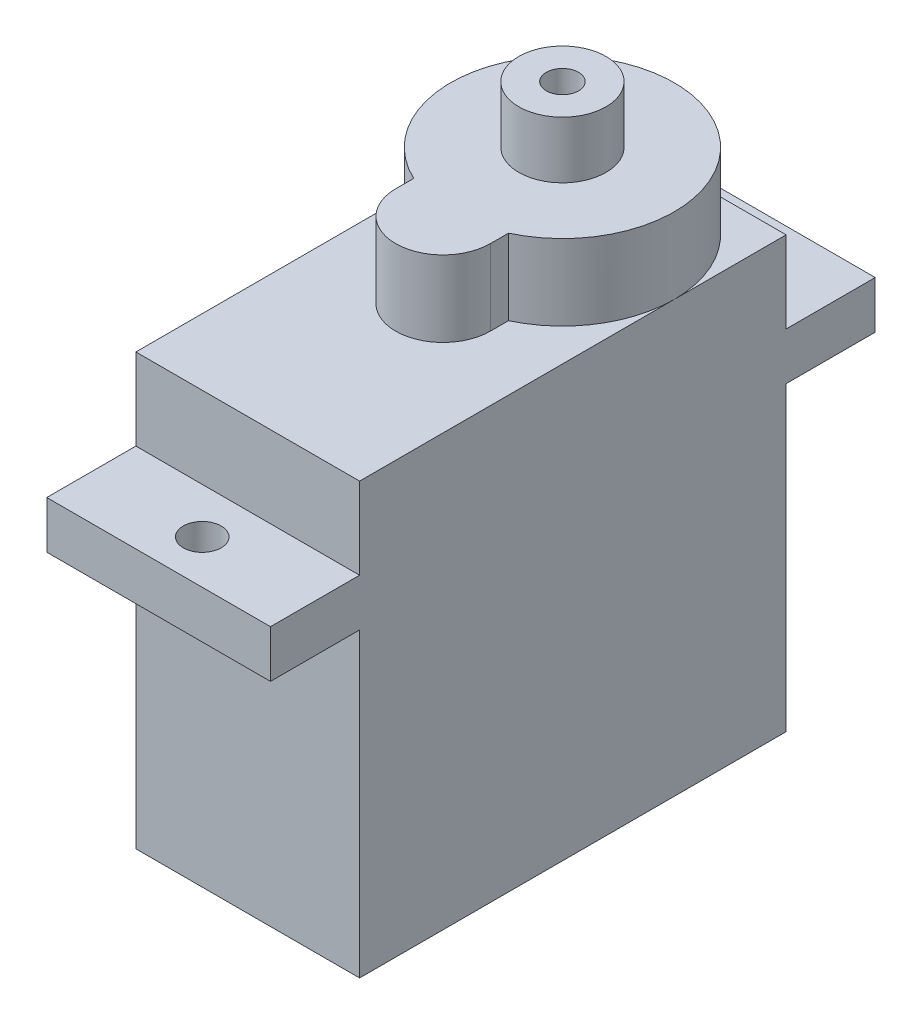
ISO-10303-21;
HEADER;
FILE_DESCRIPTION(('STEP AP214'),'2;1');
FILE_NAME('part.step','',(''),(''),'','','');
FILE_SCHEMA(('AUTOMOTIVE_DESIGN { 1 0 10303 214 1 1 1 1 }'));
ENDSEC;
DATA;
#1=APPLICATION_CONTEXT('core data for automotive mechanical design processes');
#2=APPLICATION_PROTOCOL_DEFINITION('international standard','automotive_design',2000,#1);
#3=PRODUCT_CONTEXT('',#1,'mechanical');
#4=PRODUCT('Part','Part','',(#3));
#5=PRODUCT_RELATED_PRODUCT_CATEGORY('part','',(#4));
#6=PRODUCT_DEFINITION_FORMATION('','',#4);
#7=PRODUCT_DEFINITION_CONTEXT('part definition',#1,'design');
#8=PRODUCT_DEFINITION('design','',#6,#7);
#9=PRODUCT_DEFINITION_SHAPE('','',#8);
#10=(LENGTH_UNIT() NAMED_UNIT(*) SI_UNIT(.MILLI.,.METRE.));
#11=(NAMED_UNIT(*) PLANE_ANGLE_UNIT() SI_UNIT($,.RADIAN.));
#12=(NAMED_UNIT(*) SI_UNIT($,.STERADIAN.) SOLID_ANGLE_UNIT());
#13=UNCERTAINTY_MEASURE_WITH_UNIT(LENGTH_MEASURE(1.E-05),#10,'distance_accuracy_value','');
#14=(GEOMETRIC_REPRESENTATION_CONTEXT(3) GLOBAL_UNCERTAINTY_ASSIGNED_CONTEXT((#13)) GLOBAL_UNIT_ASSIGNED_CONTEXT((#10,
#11,#12)) REPRESENTATION_CONTEXT('',''));
#15=CARTESIAN_POINT('',(0.,0.,0.));
#16=DIRECTION('',(0.,0.,1.));
#17=DIRECTION('',(1.,0.,0.));
#18=AXIS2_PLACEMENT_3D('',#15,#16,#17);
#19=CARTESIAN_POINT('',(0.,0.,22.5));
#20=DIRECTION('',(0.,0.,1.));
#21=DIRECTION('',(1.,0.,0.));
#22=AXIS2_PLACEMENT_3D('',#19,#20,#21);
#23=PLANE('',#22);
#24=DIRECTION('',(0.,1.,0.));
#25=VECTOR('',#24,1.);
#26=CARTESIAN_POINT('',(5.9,11.35,22.5));
#27=LINE('',#26,#25);
#28=CARTESIAN_POINT('',(5.9,-11.35,22.5));
#29=VERTEX_POINT('',#28);
#30=CARTESIAN_POINT('',(5.9,4.55,22.5));
#31=VERTEX_POINT('',#30);
#32=EDGE_CURVE('E75',#29,#31,#27,.T.);
#33=ORIENTED_EDGE('',*,*,#32,.T.);
#34=DIRECTION('',(-1.,0.,0.));
#35=VECTOR('',#34,1.);
#36=CARTESIAN_POINT('',(11.2235326616825,4.55,22.5));
#37=LINE('',#36,#35);
#38=CARTESIAN_POINT('',(-5.9,4.55,22.5));
#39=VERTEX_POINT('',#38);
#40=EDGE_CURVE('E208',#31,#39,#37,.T.);
#41=ORIENTED_EDGE('',*,*,#40,.T.);
#42=DIRECTION('',(0.,-1.,0.));
#43=VECTOR('',#42,1.);
#44=CARTESIAN_POINT('',(-5.9,11.35,22.5));
#45=LINE('',#44,#43);
#46=CARTESIAN_POINT('',(-5.9,-11.35,22.5));
#47=VERTEX_POINT('',#46);
#48=EDGE_CURVE('E200',#39,#47,#45,.T.);
#49=ORIENTED_EDGE('',*,*,#48,.T.);
#50=DIRECTION('',(1.,0.,0.));
#51=VECTOR('',#50,1.);
#52=CARTESIAN_POINT('',(-5.9,-11.35,22.5));
#53=LINE('',#52,#51);
#54=EDGE_CURVE('E336',#47,#29,#53,.T.);
#55=ORIENTED_EDGE('',*,*,#54,.T.);
#56=EDGE_LOOP('',(#33,#41,#49,#55));
#57=FACE_BOUND('',#56,.T.);
#58=ADVANCED_FACE('F49',(#57),#23,.T.);
#59=CARTESIAN_POINT('',(0.,0.,0.));
#60=DIRECTION('',(0.,0.,1.));
#61=DIRECTION('',(1.,0.,0.));
#62=AXIS2_PLACEMENT_3D('',#59,#60,#61);
#63=PLANE('',#62);
#64=DIRECTION('',(0.,1.,0.));
#65=VECTOR('',#64,1.);
#66=CARTESIAN_POINT('',(5.9,11.35,0.));
#67=LINE('',#66,#65);
#68=CARTESIAN_POINT('',(5.9,7.05,0.));
#69=VERTEX_POINT('',#68);
#70=CARTESIAN_POINT('',(5.9,11.35,0.));
#71=VERTEX_POINT('',#70);
#72=EDGE_CURVE('E370',#69,#71,#67,.T.);
#73=ORIENTED_EDGE('',*,*,#72,.F.);
#74=DIRECTION('',(-1.,0.,0.));
#75=VECTOR('',#74,1.);
#76=CARTESIAN_POINT('',(11.2235326616825,7.05,0.));
#77=LINE('',#76,#75);
#78=CARTESIAN_POINT('',(-5.9,7.05,0.));
#79=VERTEX_POINT('',#78);
#80=EDGE_CURVE('E264',#69,#79,#77,.T.);
#81=ORIENTED_EDGE('',*,*,#80,.T.);
#82=DIRECTION('',(0.,-1.,0.));
#83=VECTOR('',#82,1.);
#84=CARTESIAN_POINT('',(-5.9,11.35,0.));
#85=LINE('',#84,#83);
#86=CARTESIAN_POINT('',(-5.9,11.35,0.));
#87=VERTEX_POINT('',#86);
#88=EDGE_CURVE('E374',#87,#79,#85,.T.);
#89=ORIENTED_EDGE('',*,*,#88,.F.);
#90=DIRECTION('',(-1.,0.,0.));
#91=VECTOR('',#90,1.);
#92=CARTESIAN_POINT('',(-5.9,11.35,0.));
#93=LINE('',#92,#91);
#94=CARTESIAN_POINT('',(0.,11.35,0.));
#95=VERTEX_POINT('',#94);
#96=EDGE_CURVE('E365',#95,#87,#93,.T.);
#97=ORIENTED_EDGE('',*,*,#96,.F.);
#98=EDGE_CURVE('E361',#71,#95,#93,.T.);
#99=ORIENTED_EDGE('',*,*,#98,.F.);
#100=EDGE_LOOP('',(#73,#81,#89,#97,#99));
#101=FACE_BOUND('',#100,.T.);
#102=ADVANCED_FACE('F404',(#101),#63,.F.);
#103=CARTESIAN_POINT('',(-5.9,11.35,22.5));
#104=DIRECTION('',(0.,-1.,0.));
#105=DIRECTION('',(0.,0.,-1.));
#106=AXIS2_PLACEMENT_3D('',#103,#104,#105);
#107=PLANE('',#106);
#108=CARTESIAN_POINT('',(0.,11.35,5.9));
#109=DIRECTION('',(0.,1.,0.));
#110=DIRECTION('',(0.,0.,1.));
#111=AXIS2_PLACEMENT_3D('',#108,#109,#110);
#112=CIRCLE('',#111,5.9);
#113=CARTESIAN_POINT('',(-5.9,11.35,5.9));
#114=VERTEX_POINT('',#113);
#115=EDGE_CURVE('E59',#95,#114,#112,.T.);
#116=ORIENTED_EDGE('',*,*,#115,.F.);
#117=ORIENTED_EDGE('',*,*,#96,.T.);
#118=DIRECTION('',(0.,0.,-1.));
#119=VECTOR('',#118,1.);
#120=CARTESIAN_POINT('',(-5.9,11.35,22.5));
#121=LINE('',#120,#119);
#122=EDGE_CURVE('E360',#114,#87,#121,.T.);
#123=ORIENTED_EDGE('',*,*,#122,.F.);
#124=EDGE_LOOP('',(#116,#117,#123));
#125=FACE_BOUND('',#124,.T.);
#126=ADVANCED_FACE('F409',(#125),#107,.F.);
#127=CARTESIAN_POINT('',(-2.5,11.35,11.244155686355));
#128=VERTEX_POINT('',#127);
#129=EDGE_CURVE('E437',#114,#128,#112,.T.);
#130=ORIENTED_EDGE('',*,*,#129,.F.);
#131=CARTESIAN_POINT('',(-5.9,11.35,22.5));
#132=VERTEX_POINT('',#131);
#133=EDGE_CURVE('E356',#132,#114,#121,.T.);
#134=ORIENTED_EDGE('',*,*,#133,.F.);
#135=DIRECTION('',(-1.,0.,0.));
#136=VECTOR('',#135,1.);
#137=CARTESIAN_POINT('',(-5.9,11.35,22.5));
#138=LINE('',#137,#136);
#139=CARTESIAN_POINT('',(5.9,11.35,22.5));
#140=VERTEX_POINT('',#139);
#141=EDGE_CURVE('E377',#140,#132,#138,.T.);
#142=ORIENTED_EDGE('',*,*,#141,.F.);
#143=DIRECTION('',(0.,0.,-1.));
#144=VECTOR('',#143,1.);
#145=CARTESIAN_POINT('',(5.9,11.35,22.5));
#146=LINE('',#145,#144);
#147=CARTESIAN_POINT('',(5.9,11.35,5.9));
#148=VERTEX_POINT('',#147);
#149=EDGE_CURVE('E351',#140,#148,#146,.T.);
#150=ORIENTED_EDGE('',*,*,#149,.T.);
#151=CARTESIAN_POINT('',(2.5,11.35,11.244155686355));
#152=VERTEX_POINT('',#151);
#153=EDGE_CURVE('E310',#152,#148,#112,.T.);
#154=ORIENTED_EDGE('',*,*,#153,.F.);
#155=DIRECTION('',(0.,0.,-1.));
#156=VECTOR('',#155,1.);
#157=CARTESIAN_POINT('',(2.5,11.35,12.2));
#158=LINE('',#157,#156);
#159=CARTESIAN_POINT('',(2.5,11.35,12.2));
#160=VERTEX_POINT('',#159);
#161=EDGE_CURVE('E306',#160,#152,#158,.T.);
#162=ORIENTED_EDGE('',*,*,#161,.F.);
#163=CARTESIAN_POINT('',(0.,11.35,12.2));
#164=DIRECTION('',(0.,1.,0.));
#165=DIRECTION('',(0.,0.,1.));
#166=AXIS2_PLACEMENT_3D('',#163,#164,#165);
#167=CIRCLE('',#166,2.5);
#168=CARTESIAN_POINT('',(-2.5,11.35,12.2));
#169=VERTEX_POINT('',#168);
#170=EDGE_CURVE('E284',#169,#160,#167,.T.);
#171=ORIENTED_EDGE('',*,*,#170,.F.);
#172=DIRECTION('',(0.,0.,1.));
#173=VECTOR('',#172,1.);
#174=CARTESIAN_POINT('',(-2.5,11.35,12.2));
#175=LINE('',#174,#173);
#176=EDGE_CURVE('E293',#128,#169,#175,.T.);
#177=ORIENTED_EDGE('',*,*,#176,.F.);
#178=EDGE_LOOP('',(#130,#134,#142,#150,#154,#162,#171,#177));
#179=FACE_BOUND('',#178,.T.);
#180=ADVANCED_FACE('F418',(#179),#107,.F.);
#181=EDGE_CURVE('E314',#148,#95,#112,.T.);
#182=ORIENTED_EDGE('',*,*,#181,.F.);
#183=EDGE_CURVE('E355',#148,#71,#146,.T.);
#184=ORIENTED_EDGE('',*,*,#183,.T.);
#185=ORIENTED_EDGE('',*,*,#98,.T.);
#186=EDGE_LOOP('',(#182,#184,#185));
#187=FACE_BOUND('',#186,.T.);
#188=ADVANCED_FACE('F420',(#187),#107,.F.);
#189=CARTESIAN_POINT('',(-5.9,11.35,22.5));
#190=DIRECTION('',(1.,0.,0.));
#191=DIRECTION('',(0.,1.,0.));
#192=AXIS2_PLACEMENT_3D('',#189,#190,#191);
#193=PLANE('',#192);
#194=ORIENTED_EDGE('',*,*,#88,.T.);
#195=DIRECTION('',(0.,0.,-1.));
#196=VECTOR('',#195,1.);
#197=CARTESIAN_POINT('',(-5.9,7.05,-4.7));
#198=LINE('',#197,#196);
#199=CARTESIAN_POINT('',(-5.9,7.05,-4.7));
#200=VERTEX_POINT('',#199);
#201=EDGE_CURVE('E257',#79,#200,#198,.T.);
#202=ORIENTED_EDGE('',*,*,#201,.T.);
#203=DIRECTION('',(0.,-1.,0.));
#204=VECTOR('',#203,1.);
#205=CARTESIAN_POINT('',(-5.9,7.05,-4.7));
#206=LINE('',#205,#204);
#207=CARTESIAN_POINT('',(-5.9,4.55,-4.7));
#208=VERTEX_POINT('',#207);
#209=EDGE_CURVE('E238',#200,#208,#206,.T.);
#210=ORIENTED_EDGE('',*,*,#209,.T.);
#211=DIRECTION('',(0.,0.,1.));
#212=VECTOR('',#211,1.);
#213=CARTESIAN_POINT('',(-5.9,4.55,0.));
#214=LINE('',#213,#212);
#215=CARTESIAN_POINT('',(-5.9,4.55,0.));
#216=VERTEX_POINT('',#215);
#217=EDGE_CURVE('E242',#208,#216,#214,.T.);
#218=ORIENTED_EDGE('',*,*,#217,.T.);
#219=CARTESIAN_POINT('',(-5.9,-11.35,0.));
#220=VERTEX_POINT('',#219);
#221=EDGE_CURVE('E333',#216,#220,#85,.T.);
#222=ORIENTED_EDGE('',*,*,#221,.T.);
#223=DIRECTION('',(0.,0.,-1.));
#224=VECTOR('',#223,1.);
#225=CARTESIAN_POINT('',(-5.9,-11.35,22.5));
#226=LINE('',#225,#224);
#227=EDGE_CURVE('E343',#47,#220,#226,.T.);
#228=ORIENTED_EDGE('',*,*,#227,.F.);
#229=ORIENTED_EDGE('',*,*,#48,.F.);
#230=DIRECTION('',(0.,0.,1.));
#231=VECTOR('',#230,1.);
#232=CARTESIAN_POINT('',(-5.9,4.55,22.5));
#233=LINE('',#232,#231);
#234=CARTESIAN_POINT('',(-5.9,4.55,27.2));
#235=VERTEX_POINT('',#234);
#236=EDGE_CURVE('E180',#39,#235,#233,.T.);
#237=ORIENTED_EDGE('',*,*,#236,.T.);
#238=DIRECTION('',(0.,1.,0.));
#239=VECTOR('',#238,1.);
#240=CARTESIAN_POINT('',(-5.9,7.05,27.2));
#241=LINE('',#240,#239);
#242=CARTESIAN_POINT('',(-5.9,7.05,27.2));
#243=VERTEX_POINT('',#242);
#244=EDGE_CURVE('E189',#235,#243,#241,.T.);
#245=ORIENTED_EDGE('',*,*,#244,.T.);
#246=DIRECTION('',(0.,0.,-1.));
#247=VECTOR('',#246,1.);
#248=CARTESIAN_POINT('',(-5.9,7.05,27.2));
#249=LINE('',#248,#247);
#250=CARTESIAN_POINT('',(-5.9,7.05,22.5));
#251=VERTEX_POINT('',#250);
#252=EDGE_CURVE('E186',#243,#251,#249,.T.);
#253=ORIENTED_EDGE('',*,*,#252,.T.);
#254=EDGE_CURVE('E340',#132,#251,#45,.T.);
#255=ORIENTED_EDGE('',*,*,#254,.F.);
#256=ORIENTED_EDGE('',*,*,#133,.T.);
#257=ORIENTED_EDGE('',*,*,#122,.T.);
#258=EDGE_LOOP('',(#194,#202,#210,#218,#222,#228,#229,#237,#245,#253,#255,#256,#257));
#259=FACE_BOUND('',#258,.T.);
#260=ADVANCED_FACE('F51',(#259),#193,.F.);
#261=CARTESIAN_POINT('',(-5.9,-11.35,22.5));
#262=DIRECTION('',(0.,1.,0.));
#263=DIRECTION('',(0.,0.,1.));
#264=AXIS2_PLACEMENT_3D('',#261,#262,#263);
#265=PLANE('',#264);
#266=DIRECTION('',(1.,0.,0.));
#267=VECTOR('',#266,1.);
#268=CARTESIAN_POINT('',(-5.9,-11.35,0.));
#269=LINE('',#268,#267);
#270=CARTESIAN_POINT('',(5.9,-11.35,0.));
#271=VERTEX_POINT('',#270);
#272=EDGE_CURVE('E371',#220,#271,#269,.T.);
#273=ORIENTED_EDGE('',*,*,#272,.T.);
#274=DIRECTION('',(0.,0.,-1.));
#275=VECTOR('',#274,1.);
#276=CARTESIAN_POINT('',(5.9,-11.35,22.5));
#277=LINE('',#276,#275);
#278=EDGE_CURVE('E347',#29,#271,#277,.T.);
#279=ORIENTED_EDGE('',*,*,#278,.F.);
#280=ORIENTED_EDGE('',*,*,#54,.F.);
#281=ORIENTED_EDGE('',*,*,#227,.T.);
#282=EDGE_LOOP('',(#273,#279,#280,#281));
#283=FACE_BOUND('',#282,.T.);
#284=ADVANCED_FACE('F388',(#283),#265,.F.);
#285=CARTESIAN_POINT('',(5.9,11.35,22.5));
#286=DIRECTION('',(-1.,0.,0.));
#287=DIRECTION('',(0.,-1.,0.));
#288=AXIS2_PLACEMENT_3D('',#285,#286,#287);
#289=PLANE('',#288);
#290=CARTESIAN_POINT('',(5.9,4.55,0.));
#291=VERTEX_POINT('',#290);
#292=EDGE_CURVE('E366',#271,#291,#67,.T.);
#293=ORIENTED_EDGE('',*,*,#292,.T.);
#294=DIRECTION('',(0.,0.,-1.));
#295=VECTOR('',#294,1.);
#296=CARTESIAN_POINT('',(5.9,4.55,0.));
#297=LINE('',#296,#295);
#298=CARTESIAN_POINT('',(5.9,4.55,-4.7));
#299=VERTEX_POINT('',#298);
#300=EDGE_CURVE('E252',#291,#299,#297,.T.);
#301=ORIENTED_EDGE('',*,*,#300,.T.);
#302=DIRECTION('',(0.,1.,0.));
#303=VECTOR('',#302,1.);
#304=CARTESIAN_POINT('',(5.9,7.05,-4.7));
#305=LINE('',#304,#303);
#306=CARTESIAN_POINT('',(5.9,7.05,-4.7));
#307=VERTEX_POINT('',#306);
#308=EDGE_CURVE('E249',#299,#307,#305,.T.);
#309=ORIENTED_EDGE('',*,*,#308,.T.);
#310=DIRECTION('',(0.,0.,1.));
#311=VECTOR('',#310,1.);
#312=CARTESIAN_POINT('',(5.9,7.05,-4.7));
#313=LINE('',#312,#311);
#314=EDGE_CURVE('E245',#307,#69,#313,.T.);
#315=ORIENTED_EDGE('',*,*,#314,.T.);
#316=ORIENTED_EDGE('',*,*,#72,.T.);
#317=ORIENTED_EDGE('',*,*,#183,.F.);
#318=ORIENTED_EDGE('',*,*,#149,.F.);
#319=CARTESIAN_POINT('',(5.9,7.05,22.5));
#320=VERTEX_POINT('',#319);
#321=EDGE_CURVE('E224',#320,#140,#27,.T.);
#322=ORIENTED_EDGE('',*,*,#321,.F.);
#323=DIRECTION('',(0.,0.,1.));
#324=VECTOR('',#323,1.);
#325=CARTESIAN_POINT('',(5.9,7.05,27.2));
#326=LINE('',#325,#324);
#327=CARTESIAN_POINT('',(5.9,7.05,27.2));
#328=VERTEX_POINT('',#327);
#329=EDGE_CURVE('E212',#320,#328,#326,.T.);
#330=ORIENTED_EDGE('',*,*,#329,.T.);
#331=DIRECTION('',(0.,-1.,0.));
#332=VECTOR('',#331,1.);
#333=CARTESIAN_POINT('',(5.9,7.05,27.2));
#334=LINE('',#333,#332);
#335=CARTESIAN_POINT('',(5.9,4.55,27.2));
#336=VERTEX_POINT('',#335);
#337=EDGE_CURVE('E235',#328,#336,#334,.T.);
#338=ORIENTED_EDGE('',*,*,#337,.T.);
#339=DIRECTION('',(0.,0.,-1.));
#340=VECTOR('',#339,1.);
#341=CARTESIAN_POINT('',(5.9,4.55,22.5));
#342=LINE('',#341,#340);
#343=EDGE_CURVE('E181',#336,#31,#342,.T.);
#344=ORIENTED_EDGE('',*,*,#343,.T.);
#345=ORIENTED_EDGE('',*,*,#32,.F.);
#346=ORIENTED_EDGE('',*,*,#278,.T.);
#347=EDGE_LOOP('',(#293,#301,#309,#315,#316,#317,#318,#322,#330,#338,#344,#345,#346));
#348=FACE_BOUND('',#347,.T.);
#349=ADVANCED_FACE('F391',(#348),#289,.F.);
#350=DIRECTION('',(-1.,0.,0.));
#351=VECTOR('',#350,1.);
#352=CARTESIAN_POINT('',(11.2235326616825,7.05,22.5));
#353=LINE('',#352,#351);
#354=EDGE_CURVE('E67',#320,#251,#353,.T.);
#355=ORIENTED_EDGE('',*,*,#354,.F.);
#356=ORIENTED_EDGE('',*,*,#321,.T.);
#357=ORIENTED_EDGE('',*,*,#141,.T.);
#358=ORIENTED_EDGE('',*,*,#254,.T.);
#359=EDGE_LOOP('',(#355,#356,#357,#358));
#360=FACE_BOUND('',#359,.T.);
#361=ADVANCED_FACE('F393',(#360),#23,.T.);
#362=ORIENTED_EDGE('',*,*,#221,.F.);
#363=DIRECTION('',(-1.,0.,0.));
#364=VECTOR('',#363,1.);
#365=CARTESIAN_POINT('',(11.2235326616825,4.55,0.));
#366=LINE('',#365,#364);
#367=EDGE_CURVE('E268',#291,#216,#366,.T.);
#368=ORIENTED_EDGE('',*,*,#367,.F.);
#369=ORIENTED_EDGE('',*,*,#292,.F.);
#370=ORIENTED_EDGE('',*,*,#272,.F.);
#371=EDGE_LOOP('',(#362,#368,#369,#370));
#372=FACE_BOUND('',#371,.T.);
#373=ADVANCED_FACE('F399',(#372),#63,.F.);
#374=CARTESIAN_POINT('',(0.,15.35,12.2));
#375=DIRECTION('',(0.,-1.,0.));
#376=DIRECTION('',(0.,0.,-1.));
#377=AXIS2_PLACEMENT_3D('',#374,#375,#376);
#378=CYLINDRICAL_SURFACE('',#377,2.5);
#379=ORIENTED_EDGE('',*,*,#170,.T.);
#380=DIRECTION('',(0.,-1.,0.));
#381=VECTOR('',#380,1.);
#382=CARTESIAN_POINT('',(2.5,15.35,12.2));
#383=LINE('',#382,#381);
#384=CARTESIAN_POINT('',(2.5,15.35,12.2));
#385=VERTEX_POINT('',#384);
#386=EDGE_CURVE('E329',#385,#160,#383,.T.);
#387=ORIENTED_EDGE('',*,*,#386,.F.);
#388=CARTESIAN_POINT('',(0.,15.35,12.2));
#389=DIRECTION('',(0.,1.,0.));
#390=DIRECTION('',(0.,0.,1.));
#391=AXIS2_PLACEMENT_3D('',#388,#389,#390);
#392=CIRCLE('',#391,2.5);
#393=CARTESIAN_POINT('',(-2.5,15.35,12.2));
#394=VERTEX_POINT('',#393);
#395=EDGE_CURVE('E288',#394,#385,#392,.T.);
#396=ORIENTED_EDGE('',*,*,#395,.F.);
#397=DIRECTION('',(0.,-1.,0.));
#398=VECTOR('',#397,1.);
#399=CARTESIAN_POINT('',(-2.5,15.35,12.2));
#400=LINE('',#399,#398);
#401=EDGE_CURVE('E302',#394,#169,#400,.T.);
#402=ORIENTED_EDGE('',*,*,#401,.T.);
#403=EDGE_LOOP('',(#379,#387,#396,#402));
#404=FACE_BOUND('',#403,.T.);
#405=ADVANCED_FACE('F413',(#404),#378,.T.);
#406=CARTESIAN_POINT('',(2.5,15.35,12.2));
#407=DIRECTION('',(-1.,0.,0.));
#408=DIRECTION('',(0.,0.,1.));
#409=AXIS2_PLACEMENT_3D('',#406,#407,#408);
#410=PLANE('',#409);
#411=ORIENTED_EDGE('',*,*,#161,.T.);
#412=DIRECTION('',(0.,-1.,0.));
#413=VECTOR('',#412,1.);
#414=CARTESIAN_POINT('',(2.5,15.35,11.244155686355));
#415=LINE('',#414,#413);
#416=CARTESIAN_POINT('',(2.5,15.35,11.244155686355));
#417=VERTEX_POINT('',#416);
#418=EDGE_CURVE('E325',#417,#152,#415,.T.);
#419=ORIENTED_EDGE('',*,*,#418,.F.);
#420=DIRECTION('',(0.,0.,-1.));
#421=VECTOR('',#420,1.);
#422=CARTESIAN_POINT('',(2.5,15.35,12.2));
#423=LINE('',#422,#421);
#424=EDGE_CURVE('E292',#385,#417,#423,.T.);
#425=ORIENTED_EDGE('',*,*,#424,.F.);
#426=ORIENTED_EDGE('',*,*,#386,.T.);
#427=EDGE_LOOP('',(#411,#419,#425,#426));
#428=FACE_BOUND('',#427,.T.);
#429=ADVANCED_FACE('F447',(#428),#410,.F.);
#430=CARTESIAN_POINT('',(0.,15.35,5.9));
#431=DIRECTION('',(0.,-1.,0.));
#432=DIRECTION('',(0.,0.,-1.));
#433=AXIS2_PLACEMENT_3D('',#430,#431,#432);
#434=CYLINDRICAL_SURFACE('',#433,5.9);
#435=ORIENTED_EDGE('',*,*,#153,.T.);
#436=ORIENTED_EDGE('',*,*,#181,.T.);
#437=ORIENTED_EDGE('',*,*,#115,.T.);
#438=ORIENTED_EDGE('',*,*,#129,.T.);
#439=DIRECTION('',(0.,-1.,0.));
#440=VECTOR('',#439,1.);
#441=CARTESIAN_POINT('',(-2.5,15.35,11.244155686355));
#442=LINE('',#441,#440);
#443=CARTESIAN_POINT('',(-2.5,15.35,11.244155686355));
#444=VERTEX_POINT('',#443);
#445=EDGE_CURVE('E321',#444,#128,#442,.T.);
#446=ORIENTED_EDGE('',*,*,#445,.F.);
#447=CARTESIAN_POINT('',(0.,15.35,5.9));
#448=DIRECTION('',(0.,1.,0.));
#449=DIRECTION('',(0.,0.,1.));
#450=AXIS2_PLACEMENT_3D('',#447,#448,#449);
#451=CIRCLE('',#450,5.9);
#452=EDGE_CURVE('E296',#417,#444,#451,.T.);
#453=ORIENTED_EDGE('',*,*,#452,.F.);
#454=ORIENTED_EDGE('',*,*,#418,.T.);
#455=EDGE_LOOP('',(#435,#436,#437,#438,#446,#453,#454));
#456=FACE_BOUND('',#455,.T.);
#457=ADVANCED_FACE('F442',(#456),#434,.T.);
#458=CARTESIAN_POINT('',(-2.5,15.35,12.2));
#459=DIRECTION('',(1.,0.,0.));
#460=DIRECTION('',(0.,0.,-1.));
#461=AXIS2_PLACEMENT_3D('',#458,#459,#460);
#462=PLANE('',#461);
#463=ORIENTED_EDGE('',*,*,#176,.T.);
#464=ORIENTED_EDGE('',*,*,#401,.F.);
#465=DIRECTION('',(0.,0.,1.));
#466=VECTOR('',#465,1.);
#467=CARTESIAN_POINT('',(-2.5,15.35,12.2));
#468=LINE('',#467,#466);
#469=EDGE_CURVE('E299',#444,#394,#468,.T.);
#470=ORIENTED_EDGE('',*,*,#469,.F.);
#471=ORIENTED_EDGE('',*,*,#445,.T.);
#472=EDGE_LOOP('',(#463,#464,#470,#471));
#473=FACE_BOUND('',#472,.T.);
#474=ADVANCED_FACE('F453',(#473),#462,.F.);
#475=CARTESIAN_POINT('',(0.,15.35,12.2));
#476=DIRECTION('',(0.,1.,0.));
#477=DIRECTION('',(0.,0.,1.));
#478=AXIS2_PLACEMENT_3D('',#475,#476,#477);
#479=PLANE('',#478);
#480=CARTESIAN_POINT('',(0.,15.35,5.9));
#481=DIRECTION('',(0.,1.,0.));
#482=DIRECTION('',(0.,0.,1.));
#483=AXIS2_PLACEMENT_3D('',#480,#481,#482);
#484=CIRCLE('',#483,2.3);
#485=CARTESIAN_POINT('',(0.,15.35,8.2));
#486=VERTEX_POINT('',#485);
#487=EDGE_CURVE('E279',#486,#486,#484,.T.);
#488=ORIENTED_EDGE('',*,*,#487,.F.);
#489=EDGE_LOOP('',(#488));
#490=FACE_BOUND('',#489,.T.);
#491=ORIENTED_EDGE('',*,*,#395,.T.);
#492=ORIENTED_EDGE('',*,*,#424,.T.);
#493=ORIENTED_EDGE('',*,*,#452,.T.);
#494=ORIENTED_EDGE('',*,*,#469,.T.);
#495=EDGE_LOOP('',(#491,#492,#493,#494));
#496=FACE_BOUND('',#495,.T.);
#497=ADVANCED_FACE('F457',(#490,#496),#479,.T.);
#498=CARTESIAN_POINT('',(0.,18.35,5.9));
#499=DIRECTION('',(0.,1.,0.));
#500=DIRECTION('',(0.,0.,1.));
#501=AXIS2_PLACEMENT_3D('',#498,#499,#500);
#502=PLANE('',#501);
#503=CARTESIAN_POINT('',(0.,18.35,5.9));
#504=DIRECTION('',(0.,1.,0.));
#505=DIRECTION('',(0.,0.,1.));
#506=AXIS2_PLACEMENT_3D('',#503,#504,#505);
#507=CIRCLE('',#506,2.3);
#508=CARTESIAN_POINT('',(0.,18.35,8.2));
#509=VERTEX_POINT('',#508);
#510=EDGE_CURVE('E280',#509,#509,#507,.T.);
#511=ORIENTED_EDGE('',*,*,#510,.T.);
#512=EDGE_LOOP('',(#511));
#513=FACE_BOUND('',#512,.T.);
#514=CARTESIAN_POINT('',(0.,18.35,5.9));
#515=DIRECTION('',(0.,1.,0.));
#516=DIRECTION('',(0.,0.,1.));
#517=AXIS2_PLACEMENT_3D('',#514,#515,#516);
#518=CIRCLE('',#517,0.85);
#519=CARTESIAN_POINT('',(0.,18.35,6.75));
#520=VERTEX_POINT('',#519);
#521=EDGE_CURVE('E275',#520,#520,#518,.T.);
#522=ORIENTED_EDGE('',*,*,#521,.F.);
#523=EDGE_LOOP('',(#522));
#524=FACE_BOUND('',#523,.T.);
#525=ADVANCED_FACE('F506',(#513,#524),#502,.T.);
#526=CARTESIAN_POINT('',(0.,18.35,5.9));
#527=DIRECTION('',(0.,-1.,0.));
#528=DIRECTION('',(0.,0.,-1.));
#529=AXIS2_PLACEMENT_3D('',#526,#527,#528);
#530=CYLINDRICAL_SURFACE('',#529,2.3);
#531=ORIENTED_EDGE('',*,*,#510,.F.);
#532=EDGE_LOOP('',(#531));
#533=FACE_BOUND('',#532,.T.);
#534=ORIENTED_EDGE('',*,*,#487,.T.);
#535=EDGE_LOOP('',(#534));
#536=FACE_BOUND('',#535,.T.);
#537=ADVANCED_FACE('F504',(#533,#536),#530,.T.);
#538=CARTESIAN_POINT('',(0.,18.35,5.9));
#539=DIRECTION('',(0.,-1.,0.));
#540=DIRECTION('',(0.,0.,-1.));
#541=AXIS2_PLACEMENT_3D('',#538,#539,#540);
#542=CYLINDRICAL_SURFACE('',#541,0.85);
#543=ORIENTED_EDGE('',*,*,#521,.T.);
#544=EDGE_LOOP('',(#543));
#545=FACE_BOUND('',#544,.T.);
#546=CARTESIAN_POINT('',(0.,15.35,5.9));
#547=DIRECTION('',(0.,1.,0.));
#548=DIRECTION('',(0.,0.,1.));
#549=AXIS2_PLACEMENT_3D('',#546,#547,#548);
#550=CIRCLE('',#549,0.85);
#551=CARTESIAN_POINT('',(0.,15.35,6.75));
#552=VERTEX_POINT('',#551);
#553=EDGE_CURVE('E11',#552,#552,#550,.F.);
#554=ORIENTED_EDGE('',*,*,#553,.T.);
#555=EDGE_LOOP('',(#554));
#556=FACE_BOUND('',#555,.T.);
#557=ADVANCED_FACE('F501',(#545,#556),#542,.F.);
#558=ORIENTED_EDGE('',*,*,#553,.F.);
#559=EDGE_LOOP('',(#558));
#560=FACE_BOUND('',#559,.T.);
#561=ADVANCED_FACE('F500',(#560),#479,.T.);
#562=CARTESIAN_POINT('',(11.2235326616825,7.05,-4.7));
#563=DIRECTION('',(0.,0.,-1.));
#564=DIRECTION('',(-1.,0.,0.));
#565=AXIS2_PLACEMENT_3D('',#562,#563,#564);
#566=PLANE('',#565);
#567=ORIENTED_EDGE('',*,*,#308,.F.);
#568=DIRECTION('',(-1.,0.,0.));
#569=VECTOR('',#568,1.);
#570=CARTESIAN_POINT('',(11.2235326616825,4.55,-4.7));
#571=LINE('',#570,#569);
#572=EDGE_CURVE('E261',#299,#208,#571,.T.);
#573=ORIENTED_EDGE('',*,*,#572,.T.);
#574=ORIENTED_EDGE('',*,*,#209,.F.);
#575=DIRECTION('',(-1.,0.,0.));
#576=VECTOR('',#575,1.);
#577=CARTESIAN_POINT('',(11.2235326616825,7.05,-4.7));
#578=LINE('',#577,#576);
#579=EDGE_CURVE('E250',#307,#200,#578,.T.);
#580=ORIENTED_EDGE('',*,*,#579,.F.);
#581=EDGE_LOOP('',(#567,#573,#574,#580));
#582=FACE_BOUND('',#581,.T.);
#583=ADVANCED_FACE('F474',(#582),#566,.T.);
#584=CARTESIAN_POINT('',(11.2235326616825,7.05,-4.7));
#585=DIRECTION('',(0.,1.,0.));
#586=DIRECTION('',(-1.,0.,0.));
#587=AXIS2_PLACEMENT_3D('',#584,#585,#586);
#588=PLANE('',#587);
#589=CARTESIAN_POINT('',(0.,7.05,-2.4));
#590=DIRECTION('',(0.,1.,0.));
#591=DIRECTION('',(-1.,0.,0.));
#592=AXIS2_PLACEMENT_3D('',#589,#590,#591);
#593=CIRCLE('',#592,1.);
#594=CARTESIAN_POINT('',(-1.,7.05,-2.4));
#595=VERTEX_POINT('',#594);
#596=EDGE_CURVE('E202',#595,#595,#593,.T.);
#597=ORIENTED_EDGE('',*,*,#596,.F.);
#598=EDGE_LOOP('',(#597));
#599=FACE_BOUND('',#598,.T.);
#600=ORIENTED_EDGE('',*,*,#314,.F.);
#601=ORIENTED_EDGE('',*,*,#579,.T.);
#602=ORIENTED_EDGE('',*,*,#201,.F.);
#603=ORIENTED_EDGE('',*,*,#80,.F.);
#604=EDGE_LOOP('',(#600,#601,#602,#603));
#605=FACE_BOUND('',#604,.T.);
#606=ADVANCED_FACE('F469',(#599,#605),#588,.T.);
#607=CARTESIAN_POINT('',(11.2235326616825,4.55,0.));
#608=DIRECTION('',(0.,-1.,0.));
#609=DIRECTION('',(1.,0.,0.));
#610=AXIS2_PLACEMENT_3D('',#607,#608,#609);
#611=PLANE('',#610);
#612=CARTESIAN_POINT('',(0.,4.55,-2.4));
#613=DIRECTION('',(0.,-1.,0.));
#614=DIRECTION('',(1.,0.,0.));
#615=AXIS2_PLACEMENT_3D('',#612,#613,#614);
#616=CIRCLE('',#615,1.);
#617=CARTESIAN_POINT('',(0.999999999999999,4.55,-2.4));
#618=VERTEX_POINT('',#617);
#619=EDGE_CURVE('E205',#618,#618,#616,.F.);
#620=ORIENTED_EDGE('',*,*,#619,.T.);
#621=EDGE_LOOP('',(#620));
#622=FACE_BOUND('',#621,.T.);
#623=ORIENTED_EDGE('',*,*,#300,.F.);
#624=ORIENTED_EDGE('',*,*,#367,.T.);
#625=ORIENTED_EDGE('',*,*,#217,.F.);
#626=ORIENTED_EDGE('',*,*,#572,.F.);
#627=EDGE_LOOP('',(#623,#624,#625,#626));
#628=FACE_BOUND('',#627,.T.);
#629=ADVANCED_FACE('F478',(#622,#628),#611,.T.);
#630=CARTESIAN_POINT('',(11.2235326616825,4.55,22.5));
#631=DIRECTION('',(0.,-1.,0.));
#632=DIRECTION('',(1.,0.,0.));
#633=AXIS2_PLACEMENT_3D('',#630,#631,#632);
#634=PLANE('',#633);
#635=CARTESIAN_POINT('',(0.,4.55,24.9));
#636=DIRECTION('',(0.,-1.,0.));
#637=DIRECTION('',(1.,0.,0.));
#638=AXIS2_PLACEMENT_3D('',#635,#636,#637);
#639=CIRCLE('',#638,1.);
#640=CARTESIAN_POINT('',(1.,4.55,24.9));
#641=VERTEX_POINT('',#640);
#642=EDGE_CURVE('E642',#641,#641,#639,.F.);
#643=ORIENTED_EDGE('',*,*,#642,.T.);
#644=EDGE_LOOP('',(#643));
#645=FACE_BOUND('',#644,.T.);
#646=ORIENTED_EDGE('',*,*,#343,.F.);
#647=DIRECTION('',(-1.,0.,0.));
#648=VECTOR('',#647,1.);
#649=CARTESIAN_POINT('',(11.2235326616825,4.55,27.2));
#650=LINE('',#649,#648);
#651=EDGE_CURVE('E175',#336,#235,#650,.T.);
#652=ORIENTED_EDGE('',*,*,#651,.T.);
#653=ORIENTED_EDGE('',*,*,#236,.F.);
#654=ORIENTED_EDGE('',*,*,#40,.F.);
#655=EDGE_LOOP('',(#646,#652,#653,#654));
#656=FACE_BOUND('',#655,.T.);
#657=ADVANCED_FACE('F177',(#645,#656),#634,.T.);
#658=CARTESIAN_POINT('',(11.2235326616825,7.05,27.2));
#659=DIRECTION('',(0.,1.,0.));
#660=DIRECTION('',(0.,0.,1.));
#661=AXIS2_PLACEMENT_3D('',#658,#659,#660);
#662=PLANE('',#661);
#663=CARTESIAN_POINT('',(0.,7.05,24.9));
#664=DIRECTION('',(0.,1.,0.));
#665=DIRECTION('',(-1.,0.,0.));
#666=AXIS2_PLACEMENT_3D('',#663,#664,#665);
#667=CIRCLE('',#666,1.);
#668=CARTESIAN_POINT('',(-1.,7.05,24.9));
#669=VERTEX_POINT('',#668);
#670=EDGE_CURVE('E645',#669,#669,#667,.T.);
#671=ORIENTED_EDGE('',*,*,#670,.F.);
#672=EDGE_LOOP('',(#671));
#673=FACE_BOUND('',#672,.T.);
#674=ORIENTED_EDGE('',*,*,#329,.F.);
#675=ORIENTED_EDGE('',*,*,#354,.T.);
#676=ORIENTED_EDGE('',*,*,#252,.F.);
#677=DIRECTION('',(-1.,0.,0.));
#678=VECTOR('',#677,1.);
#679=CARTESIAN_POINT('',(11.2235326616825,7.05,27.2));
#680=LINE('',#679,#678);
#681=EDGE_CURVE('E185',#328,#243,#680,.T.);
#682=ORIENTED_EDGE('',*,*,#681,.F.);
#683=EDGE_LOOP('',(#674,#675,#676,#682));
#684=FACE_BOUND('',#683,.T.);
#685=ADVANCED_FACE('F491',(#673,#684),#662,.T.);
#686=CARTESIAN_POINT('',(11.2235326616825,7.05,27.2));
#687=DIRECTION('',(0.,0.,1.));
#688=DIRECTION('',(1.,0.,0.));
#689=AXIS2_PLACEMENT_3D('',#686,#687,#688);
#690=PLANE('',#689);
#691=ORIENTED_EDGE('',*,*,#337,.F.);
#692=ORIENTED_EDGE('',*,*,#681,.T.);
#693=ORIENTED_EDGE('',*,*,#244,.F.);
#694=ORIENTED_EDGE('',*,*,#651,.F.);
#695=EDGE_LOOP('',(#691,#692,#693,#694));
#696=FACE_BOUND('',#695,.T.);
#697=ADVANCED_FACE('F190',(#696),#690,.T.);
#698=CARTESIAN_POINT('',(0.,-11.351025,-2.4));
#699=DIRECTION('',(0.,1.,0.));
#700=DIRECTION('',(-1.,0.,0.));
#701=AXIS2_PLACEMENT_3D('',#698,#699,#700);
#702=CYLINDRICAL_SURFACE('',#701,1.);
#703=ORIENTED_EDGE('',*,*,#619,.F.);
#704=EDGE_LOOP('',(#703));
#705=FACE_BOUND('',#704,.T.);
#706=ORIENTED_EDGE('',*,*,#596,.T.);
#707=EDGE_LOOP('',(#706));
#708=FACE_BOUND('',#707,.T.);
#709=ADVANCED_FACE('F623',(#705,#708),#702,.F.);
#710=CARTESIAN_POINT('',(0.,-11.351025,24.9));
#711=DIRECTION('',(0.,1.,0.));
#712=DIRECTION('',(-1.,0.,0.));
#713=AXIS2_PLACEMENT_3D('',#710,#711,#712);
#714=CYLINDRICAL_SURFACE('',#713,1.);
#715=ORIENTED_EDGE('',*,*,#642,.F.);
#716=EDGE_LOOP('',(#715));
#717=FACE_BOUND('',#716,.T.);
#718=ORIENTED_EDGE('',*,*,#670,.T.);
#719=EDGE_LOOP('',(#718));
#720=FACE_BOUND('',#719,.T.);
#721=ADVANCED_FACE('F629',(#717,#720),#714,.F.);
#722=CLOSED_SHELL('',(#58,#102,#126,#180,#188,#260,#284,#349,#361,#373,#405,#429,#457,#474,#497,
#525,#537,#557,#561,#583,#606,#629,#657,#685,#697,#709,#721));
#723=MANIFOLD_SOLID_BREP('B2',#722);
#724=ADVANCED_BREP_SHAPE_REPRESENTATION('',(#18,#723),#14);
#725=SHAPE_DEFINITION_REPRESENTATION(#9,#724);
ENDSEC;
END-ISO-10303-21;
